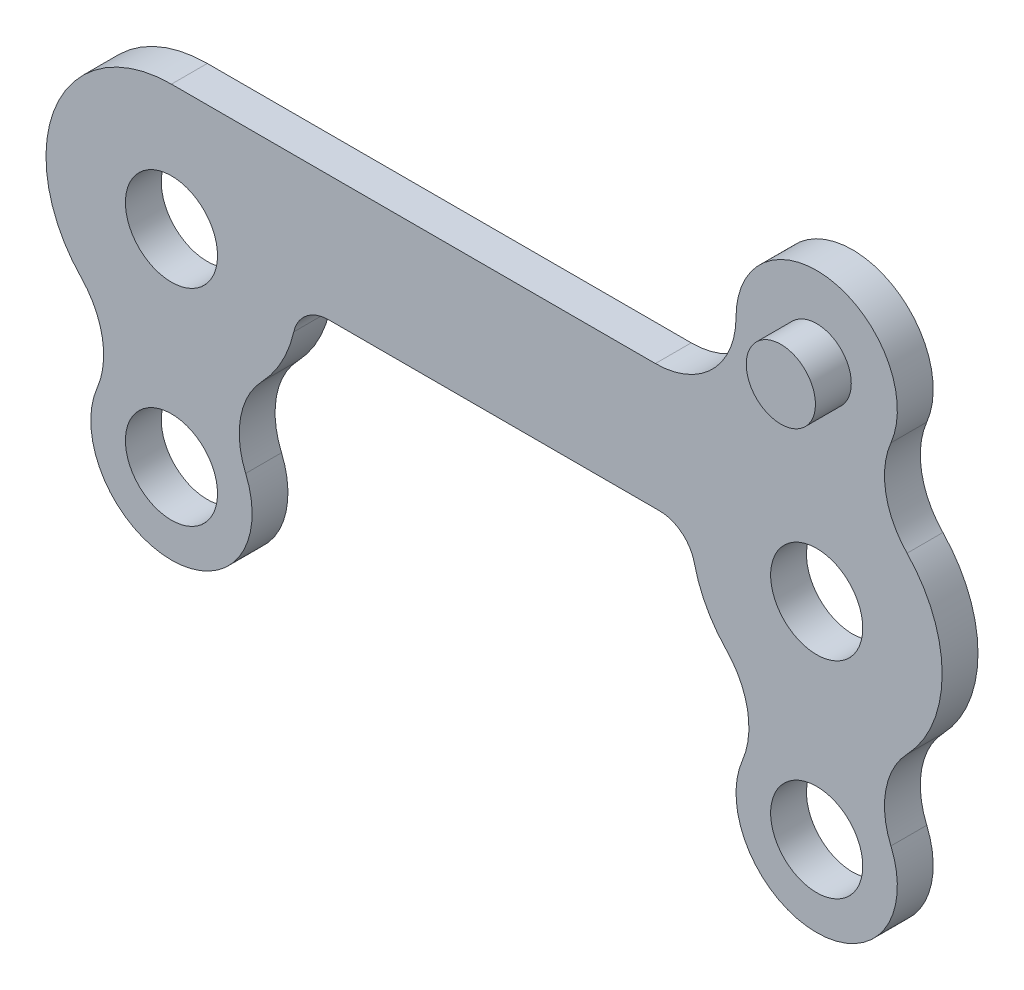
ISO-10303-21;
HEADER;
FILE_DESCRIPTION(('STEP AP214'),'2;1');
FILE_NAME('part.step','',(''),(''),'','','');
FILE_SCHEMA(('AUTOMOTIVE_DESIGN { 1 0 10303 214 1 1 1 1 }'));
ENDSEC;
DATA;
#1=APPLICATION_CONTEXT('core data for automotive mechanical design processes');
#2=APPLICATION_PROTOCOL_DEFINITION('international standard','automotive_design',2000,#1);
#3=PRODUCT_CONTEXT('',#1,'mechanical');
#4=PRODUCT('Part','Part','',(#3));
#5=PRODUCT_RELATED_PRODUCT_CATEGORY('part','',(#4));
#6=PRODUCT_DEFINITION_FORMATION('','',#4);
#7=PRODUCT_DEFINITION_CONTEXT('part definition',#1,'design');
#8=PRODUCT_DEFINITION('design','',#6,#7);
#9=PRODUCT_DEFINITION_SHAPE('','',#8);
#10=(LENGTH_UNIT() NAMED_UNIT(*) SI_UNIT(.MILLI.,.METRE.));
#11=(NAMED_UNIT(*) PLANE_ANGLE_UNIT() SI_UNIT($,.RADIAN.));
#12=(NAMED_UNIT(*) SI_UNIT($,.STERADIAN.) SOLID_ANGLE_UNIT());
#13=UNCERTAINTY_MEASURE_WITH_UNIT(LENGTH_MEASURE(1.E-05),#10,'distance_accuracy_value','');
#14=(GEOMETRIC_REPRESENTATION_CONTEXT(3) GLOBAL_UNCERTAINTY_ASSIGNED_CONTEXT((#13)) GLOBAL_UNIT_ASSIGNED_CONTEXT((#10,
#11,#12)) REPRESENTATION_CONTEXT('',''));
#15=CARTESIAN_POINT('',(0.,0.,0.));
#16=DIRECTION('',(0.,0.,1.));
#17=DIRECTION('',(1.,0.,0.));
#18=AXIS2_PLACEMENT_3D('',#15,#16,#17);
#19=CARTESIAN_POINT('',(35.149116844667,6.33274456521739,1.5875));
#20=DIRECTION('',(0.,0.,-1.));
#21=DIRECTION('',(-1.,0.,0.));
#22=AXIS2_PLACEMENT_3D('',#19,#20,#21);
#23=CYLINDRICAL_SURFACE('',#22,3.571875);
#24=CARTESIAN_POINT('',(35.149116844667,6.33274456521739,0.));
#25=DIRECTION('',(0.,0.,1.));
#26=DIRECTION('',(1.,0.,0.));
#27=AXIS2_PLACEMENT_3D('',#24,#25,#26);
#28=CIRCLE('',#27,3.571875);
#29=CARTESIAN_POINT('',(31.8620584223335,7.73043478260869,0.));
#30=VERTEX_POINT('',#29);
#31=CARTESIAN_POINT('',(32.5766363402321,3.8547140831758,0.));
#32=VERTEX_POINT('',#31);
#33=EDGE_CURVE('E165',#30,#32,#28,.T.);
#34=ORIENTED_EDGE('',*,*,#33,.F.);
#35=DIRECTION('',(0.,0.,-1.));
#36=VECTOR('',#35,1.);
#37=CARTESIAN_POINT('',(31.8620584223335,7.73043478260869,1.5875));
#38=LINE('',#37,#36);
#39=CARTESIAN_POINT('',(31.8620584223335,7.73043478260869,1.5875));
#40=VERTEX_POINT('',#39);
#41=EDGE_CURVE('E160',#40,#30,#38,.T.);
#42=ORIENTED_EDGE('',*,*,#41,.F.);
#43=CARTESIAN_POINT('',(35.149116844667,6.33274456521739,1.5875));
#44=DIRECTION('',(0.,0.,1.));
#45=DIRECTION('',(1.,0.,0.));
#46=AXIS2_PLACEMENT_3D('',#43,#44,#45);
#47=CIRCLE('',#46,3.571875);
#48=CARTESIAN_POINT('',(32.5766363402321,3.8547140831758,1.5875));
#49=VERTEX_POINT('',#48);
#50=EDGE_CURVE('E163',#40,#49,#47,.T.);
#51=ORIENTED_EDGE('',*,*,#50,.T.);
#52=DIRECTION('',(0.,0.,-1.));
#53=VECTOR('',#52,1.);
#54=CARTESIAN_POINT('',(32.5766363402321,3.8547140831758,1.5875));
#55=LINE('',#54,#53);
#56=EDGE_CURVE('E257',#49,#32,#55,.T.);
#57=ORIENTED_EDGE('',*,*,#56,.T.);
#58=EDGE_LOOP('',(#34,#42,#51,#57));
#59=FACE_BOUND('',#58,.T.);
#60=ADVANCED_FACE('F40',(#59),#23,.F.);
#61=CARTESIAN_POINT('',(28.575,9.128125,1.5875));
#62=DIRECTION('',(0.,0.,-1.));
#63=DIRECTION('',(-1.,0.,0.));
#64=AXIS2_PLACEMENT_3D('',#61,#62,#63);
#65=CYLINDRICAL_SURFACE('',#64,3.571875);
#66=CARTESIAN_POINT('',(28.575,9.128125,0.));
#67=DIRECTION('',(0.,0.,1.));
#68=DIRECTION('',(1.,0.,0.));
#69=AXIS2_PLACEMENT_3D('',#66,#67,#68);
#70=CIRCLE('',#69,3.571875);
#71=CARTESIAN_POINT('',(25.003125,9.128125,0.));
#72=VERTEX_POINT('',#71);
#73=EDGE_CURVE('E260',#30,#72,#70,.T.);
#74=ORIENTED_EDGE('',*,*,#73,.T.);
#75=DIRECTION('',(0.,0.,-1.));
#76=VECTOR('',#75,1.);
#77=CARTESIAN_POINT('',(25.003125,9.128125,1.5875));
#78=LINE('',#77,#76);
#79=CARTESIAN_POINT('',(25.003125,9.128125,1.5875));
#80=VERTEX_POINT('',#79);
#81=EDGE_CURVE('E171',#80,#72,#78,.T.);
#82=ORIENTED_EDGE('',*,*,#81,.F.);
#83=CARTESIAN_POINT('',(28.575,9.128125,1.5875));
#84=DIRECTION('',(0.,0.,1.));
#85=DIRECTION('',(1.,0.,0.));
#86=AXIS2_PLACEMENT_3D('',#83,#84,#85);
#87=CIRCLE('',#86,3.571875);
#88=EDGE_CURVE('E174',#40,#80,#87,.T.);
#89=ORIENTED_EDGE('',*,*,#88,.F.);
#90=ORIENTED_EDGE('',*,*,#41,.T.);
#91=EDGE_LOOP('',(#74,#82,#89,#90));
#92=FACE_BOUND('',#91,.T.);
#93=ADVANCED_FACE('F175',(#92),#65,.T.);
#94=CARTESIAN_POINT('',(21.43125,9.128125,1.5875));
#95=DIRECTION('',(0.,0.,-1.));
#96=DIRECTION('',(-1.,0.,0.));
#97=AXIS2_PLACEMENT_3D('',#94,#95,#96);
#98=CYLINDRICAL_SURFACE('',#97,3.571875);
#99=CARTESIAN_POINT('',(21.43125,9.128125,0.));
#100=DIRECTION('',(0.,0.,1.));
#101=DIRECTION('',(1.,0.,0.));
#102=AXIS2_PLACEMENT_3D('',#99,#100,#101);
#103=CIRCLE('',#102,3.571875);
#104=CARTESIAN_POINT('',(21.43125,5.55625,0.));
#105=VERTEX_POINT('',#104);
#106=EDGE_CURVE('E263',#105,#72,#103,.T.);
#107=ORIENTED_EDGE('',*,*,#106,.F.);
#108=DIRECTION('',(0.,0.,-1.));
#109=VECTOR('',#108,1.);
#110=CARTESIAN_POINT('',(21.43125,5.55625,1.5875));
#111=LINE('',#110,#109);
#112=CARTESIAN_POINT('',(21.43125,5.55625,1.5875));
#113=VERTEX_POINT('',#112);
#114=EDGE_CURVE('E349',#113,#105,#111,.T.);
#115=ORIENTED_EDGE('',*,*,#114,.F.);
#116=CARTESIAN_POINT('',(21.43125,9.128125,1.5875));
#117=DIRECTION('',(0.,0.,1.));
#118=DIRECTION('',(1.,0.,0.));
#119=AXIS2_PLACEMENT_3D('',#116,#117,#118);
#120=CIRCLE('',#119,3.571875);
#121=EDGE_CURVE('E180',#113,#80,#120,.T.);
#122=ORIENTED_EDGE('',*,*,#121,.T.);
#123=ORIENTED_EDGE('',*,*,#81,.T.);
#124=EDGE_LOOP('',(#107,#115,#122,#123));
#125=FACE_BOUND('',#124,.T.);
#126=ADVANCED_FACE('F414',(#125),#98,.F.);
#127=CARTESIAN_POINT('',(0.,5.55625,1.5875));
#128=DIRECTION('',(0.,1.,0.));
#129=DIRECTION('',(0.,0.,1.));
#130=AXIS2_PLACEMENT_3D('',#127,#128,#129);
#131=PLANE('',#130);
#132=DIRECTION('',(1.,0.,0.));
#133=VECTOR('',#132,1.);
#134=CARTESIAN_POINT('',(0.,5.55625,0.));
#135=LINE('',#134,#133);
#136=CARTESIAN_POINT('',(0.,5.55625,0.));
#137=VERTEX_POINT('',#136);
#138=EDGE_CURVE('E267',#137,#105,#135,.T.);
#139=ORIENTED_EDGE('',*,*,#138,.F.);
#140=DIRECTION('',(0.,0.,-1.));
#141=VECTOR('',#140,1.);
#142=CARTESIAN_POINT('',(0.,5.55625,1.5875));
#143=LINE('',#142,#141);
#144=CARTESIAN_POINT('',(0.,5.55625,1.5875));
#145=VERTEX_POINT('',#144);
#146=EDGE_CURVE('E346',#145,#137,#143,.T.);
#147=ORIENTED_EDGE('',*,*,#146,.F.);
#148=DIRECTION('',(1.,0.,0.));
#149=VECTOR('',#148,1.);
#150=CARTESIAN_POINT('',(0.,5.55625,1.5875));
#151=LINE('',#150,#149);
#152=EDGE_CURVE('E200',#145,#113,#151,.T.);
#153=ORIENTED_EDGE('',*,*,#152,.T.);
#154=ORIENTED_EDGE('',*,*,#114,.T.);
#155=EDGE_LOOP('',(#139,#147,#153,#154));
#156=FACE_BOUND('',#155,.T.);
#157=ADVANCED_FACE('F417',(#156),#131,.T.);
#158=CARTESIAN_POINT('',(0.,0.,1.5875));
#159=DIRECTION('',(0.,0.,-1.));
#160=DIRECTION('',(-1.,0.,0.));
#161=AXIS2_PLACEMENT_3D('',#158,#159,#160);
#162=CYLINDRICAL_SURFACE('',#161,5.55625);
#163=CARTESIAN_POINT('',(0.,0.,0.));
#164=DIRECTION('',(0.,0.,1.));
#165=DIRECTION('',(1.,0.,0.));
#166=AXIS2_PLACEMENT_3D('',#163,#164,#165);
#167=CIRCLE('',#166,5.55625);
#168=CARTESIAN_POINT('',(-4.0016363402321,-3.8547140831758,0.));
#169=VERTEX_POINT('',#168);
#170=EDGE_CURVE('E271',#137,#169,#167,.T.);
#171=ORIENTED_EDGE('',*,*,#170,.T.);
#172=DIRECTION('',(0.,0.,-1.));
#173=VECTOR('',#172,1.);
#174=CARTESIAN_POINT('',(-4.0016363402321,-3.8547140831758,1.5875));
#175=LINE('',#174,#173);
#176=CARTESIAN_POINT('',(-4.0016363402321,-3.8547140831758,1.5875));
#177=VERTEX_POINT('',#176);
#178=EDGE_CURVE('E343',#177,#169,#175,.T.);
#179=ORIENTED_EDGE('',*,*,#178,.F.);
#180=CARTESIAN_POINT('',(0.,0.,1.5875));
#181=DIRECTION('',(0.,0.,1.));
#182=DIRECTION('',(1.,0.,0.));
#183=AXIS2_PLACEMENT_3D('',#180,#181,#182);
#184=CIRCLE('',#183,5.55625);
#185=EDGE_CURVE('E204',#145,#177,#184,.T.);
#186=ORIENTED_EDGE('',*,*,#185,.F.);
#187=ORIENTED_EDGE('',*,*,#146,.T.);
#188=EDGE_LOOP('',(#171,#179,#186,#187));
#189=FACE_BOUND('',#188,.T.);
#190=ADVANCED_FACE('F421',(#189),#162,.T.);
#191=CARTESIAN_POINT('',(-6.57411684466701,-6.33274456521738,1.5875));
#192=DIRECTION('',(0.,0.,-1.));
#193=DIRECTION('',(-1.,0.,0.));
#194=AXIS2_PLACEMENT_3D('',#191,#192,#193);
#195=CYLINDRICAL_SURFACE('',#194,3.571875);
#196=CARTESIAN_POINT('',(-6.57411684466701,-6.33274456521738,0.));
#197=DIRECTION('',(0.,0.,1.));
#198=DIRECTION('',(1.,0.,0.));
#199=AXIS2_PLACEMENT_3D('',#196,#197,#198);
#200=CIRCLE('',#199,3.571875);
#201=CARTESIAN_POINT('',(-3.28705842233351,-7.73043478260869,0.));
#202=VERTEX_POINT('',#201);
#203=EDGE_CURVE('E275',#202,#169,#200,.T.);
#204=ORIENTED_EDGE('',*,*,#203,.F.);
#205=DIRECTION('',(0.,0.,-1.));
#206=VECTOR('',#205,1.);
#207=CARTESIAN_POINT('',(-3.28705842233351,-7.73043478260869,1.5875));
#208=LINE('',#207,#206);
#209=CARTESIAN_POINT('',(-3.28705842233351,-7.73043478260869,1.5875));
#210=VERTEX_POINT('',#209);
#211=EDGE_CURVE('E340',#210,#202,#208,.T.);
#212=ORIENTED_EDGE('',*,*,#211,.F.);
#213=CARTESIAN_POINT('',(-6.57411684466701,-6.33274456521738,1.5875));
#214=DIRECTION('',(0.,0.,1.));
#215=DIRECTION('',(1.,0.,0.));
#216=AXIS2_PLACEMENT_3D('',#213,#214,#215);
#217=CIRCLE('',#216,3.571875);
#218=EDGE_CURVE('E207',#210,#177,#217,.T.);
#219=ORIENTED_EDGE('',*,*,#218,.T.);
#220=ORIENTED_EDGE('',*,*,#178,.T.);
#221=EDGE_LOOP('',(#204,#212,#219,#220));
#222=FACE_BOUND('',#221,.T.);
#223=ADVANCED_FACE('F427',(#222),#195,.F.);
#224=CARTESIAN_POINT('',(0.,-9.128125,1.5875));
#225=DIRECTION('',(0.,0.,-1.));
#226=DIRECTION('',(-1.,0.,0.));
#227=AXIS2_PLACEMENT_3D('',#224,#225,#226);
#228=CYLINDRICAL_SURFACE('',#227,3.571875);
#229=CARTESIAN_POINT('',(0.,-9.128125,0.));
#230=DIRECTION('',(0.,0.,1.));
#231=DIRECTION('',(1.,0.,0.));
#232=AXIS2_PLACEMENT_3D('',#229,#230,#231);
#233=CIRCLE('',#232,3.571875);
#234=CARTESIAN_POINT('',(3.28705842233351,-7.73043478260869,0.));
#235=VERTEX_POINT('',#234);
#236=EDGE_CURVE('E280',#202,#235,#233,.T.);
#237=ORIENTED_EDGE('',*,*,#236,.T.);
#238=DIRECTION('',(0.,0.,-1.));
#239=VECTOR('',#238,1.);
#240=CARTESIAN_POINT('',(3.28705842233351,-7.73043478260869,1.5875));
#241=LINE('',#240,#239);
#242=CARTESIAN_POINT('',(3.28705842233351,-7.73043478260869,1.5875));
#243=VERTEX_POINT('',#242);
#244=EDGE_CURVE('E337',#243,#235,#241,.T.);
#245=ORIENTED_EDGE('',*,*,#244,.F.);
#246=CARTESIAN_POINT('',(0.,-9.128125,1.5875));
#247=DIRECTION('',(0.,0.,1.));
#248=DIRECTION('',(1.,0.,0.));
#249=AXIS2_PLACEMENT_3D('',#246,#247,#248);
#250=CIRCLE('',#249,3.571875);
#251=EDGE_CURVE('E212',#210,#243,#250,.T.);
#252=ORIENTED_EDGE('',*,*,#251,.F.);
#253=ORIENTED_EDGE('',*,*,#211,.T.);
#254=EDGE_LOOP('',(#237,#245,#252,#253));
#255=FACE_BOUND('',#254,.T.);
#256=ADVANCED_FACE('F430',(#255),#228,.T.);
#257=CARTESIAN_POINT('',(6.57411684466701,-6.33274456521738,1.5875));
#258=DIRECTION('',(0.,0.,-1.));
#259=DIRECTION('',(-1.,0.,0.));
#260=AXIS2_PLACEMENT_3D('',#257,#258,#259);
#261=CYLINDRICAL_SURFACE('',#260,3.571875);
#262=CARTESIAN_POINT('',(6.57411684466701,-6.33274456521738,0.));
#263=DIRECTION('',(0.,0.,1.));
#264=DIRECTION('',(1.,0.,0.));
#265=AXIS2_PLACEMENT_3D('',#262,#263,#264);
#266=CIRCLE('',#265,3.571875);
#267=CARTESIAN_POINT('',(4.0016363402321,-3.8547140831758,0.));
#268=VERTEX_POINT('',#267);
#269=EDGE_CURVE('E284',#268,#235,#266,.T.);
#270=ORIENTED_EDGE('',*,*,#269,.F.);
#271=DIRECTION('',(0.,0.,-1.));
#272=VECTOR('',#271,1.);
#273=CARTESIAN_POINT('',(4.0016363402321,-3.8547140831758,1.5875));
#274=LINE('',#273,#272);
#275=CARTESIAN_POINT('',(4.0016363402321,-3.8547140831758,1.5875));
#276=VERTEX_POINT('',#275);
#277=EDGE_CURVE('E334',#276,#268,#274,.T.);
#278=ORIENTED_EDGE('',*,*,#277,.F.);
#279=CARTESIAN_POINT('',(6.57411684466701,-6.33274456521738,1.5875));
#280=DIRECTION('',(0.,0.,1.));
#281=DIRECTION('',(1.,0.,0.));
#282=AXIS2_PLACEMENT_3D('',#279,#280,#281);
#283=CIRCLE('',#282,3.571875);
#284=EDGE_CURVE('E215',#276,#243,#283,.T.);
#285=ORIENTED_EDGE('',*,*,#284,.T.);
#286=ORIENTED_EDGE('',*,*,#244,.T.);
#287=EDGE_LOOP('',(#270,#278,#285,#286));
#288=FACE_BOUND('',#287,.T.);
#289=ADVANCED_FACE('F433',(#288),#261,.F.);
#290=CARTESIAN_POINT('',(5.41732176416083,-1.23472222222222,0.));
#291=VERTEX_POINT('',#290);
#292=EDGE_CURVE('E276',#268,#291,#167,.T.);
#293=ORIENTED_EDGE('',*,*,#292,.T.);
#294=DIRECTION('',(0.,0.,-1.));
#295=VECTOR('',#294,1.);
#296=CARTESIAN_POINT('',(5.41732176416083,-1.23472222222222,1.5875));
#297=LINE('',#296,#295);
#298=CARTESIAN_POINT('',(5.41732176416083,-1.23472222222222,1.5875));
#299=VERTEX_POINT('',#298);
#300=EDGE_CURVE('E56',#291,#299,#297,.F.);
#301=ORIENTED_EDGE('',*,*,#300,.T.);
#302=EDGE_CURVE('E208',#276,#299,#184,.T.);
#303=ORIENTED_EDGE('',*,*,#302,.F.);
#304=ORIENTED_EDGE('',*,*,#277,.T.);
#305=EDGE_LOOP('',(#293,#301,#303,#304));
#306=FACE_BOUND('',#305,.T.);
#307=ADVANCED_FACE('F434',(#306),#162,.T.);
#308=CARTESIAN_POINT('',(0.,0.,1.5875));
#309=DIRECTION('',(0.,1.,0.));
#310=DIRECTION('',(0.,0.,1.));
#311=AXIS2_PLACEMENT_3D('',#308,#309,#310);
#312=PLANE('',#311);
#313=DIRECTION('',(1.,0.,0.));
#314=VECTOR('',#313,1.);
#315=CARTESIAN_POINT('',(0.,0.,0.));
#316=LINE('',#315,#314);
#317=CARTESIAN_POINT('',(6.9651279824925,0.,0.));
#318=VERTEX_POINT('',#317);
#319=CARTESIAN_POINT('',(21.6098720175075,0.,0.));
#320=VERTEX_POINT('',#319);
#321=EDGE_CURVE('E288',#318,#320,#316,.T.);
#322=ORIENTED_EDGE('',*,*,#321,.T.);
#323=DIRECTION('',(0.,0.,1.));
#324=VECTOR('',#323,1.);
#325=CARTESIAN_POINT('',(21.6098720175075,0.,1.5875));
#326=LINE('',#325,#324);
#327=CARTESIAN_POINT('',(21.6098720175075,0.,1.5875));
#328=VERTEX_POINT('',#327);
#329=EDGE_CURVE('E361',#320,#328,#326,.T.);
#330=ORIENTED_EDGE('',*,*,#329,.T.);
#331=DIRECTION('',(1.,0.,0.));
#332=VECTOR('',#331,1.);
#333=CARTESIAN_POINT('',(0.,0.,1.5875));
#334=LINE('',#333,#332);
#335=CARTESIAN_POINT('',(6.9651279824925,0.,1.5875));
#336=VERTEX_POINT('',#335);
#337=EDGE_CURVE('E219',#336,#328,#334,.T.);
#338=ORIENTED_EDGE('',*,*,#337,.F.);
#339=DIRECTION('',(0.,0.,1.));
#340=VECTOR('',#339,1.);
#341=CARTESIAN_POINT('',(6.9651279824925,0.,0.));
#342=LINE('',#341,#340);
#343=EDGE_CURVE('E357',#336,#318,#342,.F.);
#344=ORIENTED_EDGE('',*,*,#343,.T.);
#345=EDGE_LOOP('',(#322,#330,#338,#344));
#346=FACE_BOUND('',#345,.T.);
#347=ADVANCED_FACE('F380',(#346),#312,.F.);
#348=CARTESIAN_POINT('',(28.575,0.,1.5875));
#349=DIRECTION('',(0.,0.,-1.));
#350=DIRECTION('',(-1.,0.,0.));
#351=AXIS2_PLACEMENT_3D('',#348,#349,#350);
#352=CYLINDRICAL_SURFACE('',#351,5.55625);
#353=CARTESIAN_POINT('',(28.575,0.,1.5875));
#354=DIRECTION('',(0.,0.,1.));
#355=DIRECTION('',(1.,0.,0.));
#356=AXIS2_PLACEMENT_3D('',#353,#354,#355);
#357=CIRCLE('',#356,5.55625);
#358=CARTESIAN_POINT('',(23.1576782358392,-1.23472222222222,1.5875));
#359=VERTEX_POINT('',#358);
#360=CARTESIAN_POINT('',(24.5733636597679,-3.8547140831758,1.5875));
#361=VERTEX_POINT('',#360);
#362=EDGE_CURVE('E223',#359,#361,#357,.T.);
#363=ORIENTED_EDGE('',*,*,#362,.F.);
#364=DIRECTION('',(0.,0.,-1.));
#365=VECTOR('',#364,1.);
#366=CARTESIAN_POINT('',(23.1576782358392,-1.23472222222222,1.5875));
#367=LINE('',#366,#365);
#368=CARTESIAN_POINT('',(23.1576782358392,-1.23472222222222,0.));
#369=VERTEX_POINT('',#368);
#370=EDGE_CURVE('E170',#359,#369,#367,.T.);
#371=ORIENTED_EDGE('',*,*,#370,.T.);
#372=CARTESIAN_POINT('',(28.575,0.,0.));
#373=DIRECTION('',(0.,0.,1.));
#374=DIRECTION('',(1.,0.,0.));
#375=AXIS2_PLACEMENT_3D('',#372,#373,#374);
#376=CIRCLE('',#375,5.55625);
#377=CARTESIAN_POINT('',(24.5733636597679,-3.8547140831758,0.));
#378=VERTEX_POINT('',#377);
#379=EDGE_CURVE('E292',#369,#378,#376,.T.);
#380=ORIENTED_EDGE('',*,*,#379,.T.);
#381=DIRECTION('',(0.,0.,-1.));
#382=VECTOR('',#381,1.);
#383=CARTESIAN_POINT('',(24.5733636597679,-3.8547140831758,1.5875));
#384=LINE('',#383,#382);
#385=EDGE_CURVE('E330',#361,#378,#384,.T.);
#386=ORIENTED_EDGE('',*,*,#385,.F.);
#387=EDGE_LOOP('',(#363,#371,#380,#386));
#388=FACE_BOUND('',#387,.T.);
#389=ADVANCED_FACE('F391',(#388),#352,.T.);
#390=CARTESIAN_POINT('',(22.000883155333,-6.33274456521739,1.5875));
#391=DIRECTION('',(0.,0.,-1.));
#392=DIRECTION('',(-1.,0.,0.));
#393=AXIS2_PLACEMENT_3D('',#390,#391,#392);
#394=CYLINDRICAL_SURFACE('',#393,3.571875);
#395=CARTESIAN_POINT('',(22.000883155333,-6.33274456521739,0.));
#396=DIRECTION('',(0.,0.,1.));
#397=DIRECTION('',(1.,0.,0.));
#398=AXIS2_PLACEMENT_3D('',#395,#396,#397);
#399=CIRCLE('',#398,3.571875);
#400=CARTESIAN_POINT('',(25.2879415776665,-7.7304347826087,0.));
#401=VERTEX_POINT('',#400);
#402=EDGE_CURVE('E295',#401,#378,#399,.T.);
#403=ORIENTED_EDGE('',*,*,#402,.F.);
#404=DIRECTION('',(0.,0.,-1.));
#405=VECTOR('',#404,1.);
#406=CARTESIAN_POINT('',(25.2879415776665,-7.7304347826087,1.5875));
#407=LINE('',#406,#405);
#408=CARTESIAN_POINT('',(25.2879415776665,-7.7304347826087,1.5875));
#409=VERTEX_POINT('',#408);
#410=EDGE_CURVE('E327',#409,#401,#407,.T.);
#411=ORIENTED_EDGE('',*,*,#410,.F.);
#412=CARTESIAN_POINT('',(22.000883155333,-6.33274456521739,1.5875));
#413=DIRECTION('',(0.,0.,1.));
#414=DIRECTION('',(1.,0.,0.));
#415=AXIS2_PLACEMENT_3D('',#412,#413,#414);
#416=CIRCLE('',#415,3.571875);
#417=EDGE_CURVE('E226',#409,#361,#416,.T.);
#418=ORIENTED_EDGE('',*,*,#417,.T.);
#419=ORIENTED_EDGE('',*,*,#385,.T.);
#420=EDGE_LOOP('',(#403,#411,#418,#419));
#421=FACE_BOUND('',#420,.T.);
#422=ADVANCED_FACE('F398',(#421),#394,.F.);
#423=CARTESIAN_POINT('',(28.575,-9.128125,1.5875));
#424=DIRECTION('',(0.,0.,-1.));
#425=DIRECTION('',(-1.,0.,0.));
#426=AXIS2_PLACEMENT_3D('',#423,#424,#425);
#427=CYLINDRICAL_SURFACE('',#426,3.57187499999999);
#428=CARTESIAN_POINT('',(28.575,-9.128125,0.));
#429=DIRECTION('',(0.,0.,1.));
#430=DIRECTION('',(1.,0.,0.));
#431=AXIS2_PLACEMENT_3D('',#428,#429,#430);
#432=CIRCLE('',#431,3.57187499999999);
#433=CARTESIAN_POINT('',(31.8620584223335,-7.73043478260869,0.));
#434=VERTEX_POINT('',#433);
#435=EDGE_CURVE('E300',#401,#434,#432,.T.);
#436=ORIENTED_EDGE('',*,*,#435,.T.);
#437=DIRECTION('',(0.,0.,-1.));
#438=VECTOR('',#437,1.);
#439=CARTESIAN_POINT('',(31.8620584223335,-7.73043478260869,1.5875));
#440=LINE('',#439,#438);
#441=CARTESIAN_POINT('',(31.8620584223335,-7.73043478260869,1.5875));
#442=VERTEX_POINT('',#441);
#443=EDGE_CURVE('E324',#442,#434,#440,.T.);
#444=ORIENTED_EDGE('',*,*,#443,.F.);
#445=CARTESIAN_POINT('',(28.575,-9.128125,1.5875));
#446=DIRECTION('',(0.,0.,1.));
#447=DIRECTION('',(1.,0.,0.));
#448=AXIS2_PLACEMENT_3D('',#445,#446,#447);
#449=CIRCLE('',#448,3.57187499999999);
#450=EDGE_CURVE('E230',#409,#442,#449,.T.);
#451=ORIENTED_EDGE('',*,*,#450,.F.);
#452=ORIENTED_EDGE('',*,*,#410,.T.);
#453=EDGE_LOOP('',(#436,#444,#451,#452));
#454=FACE_BOUND('',#453,.T.);
#455=ADVANCED_FACE('F401',(#454),#427,.T.);
#456=CARTESIAN_POINT('',(35.149116844667,-6.33274456521738,1.5875));
#457=DIRECTION('',(0.,0.,-1.));
#458=DIRECTION('',(-1.,0.,0.));
#459=AXIS2_PLACEMENT_3D('',#456,#457,#458);
#460=CYLINDRICAL_SURFACE('',#459,3.57187499999999);
#461=CARTESIAN_POINT('',(35.149116844667,-6.33274456521738,0.));
#462=DIRECTION('',(0.,0.,1.));
#463=DIRECTION('',(1.,0.,0.));
#464=AXIS2_PLACEMENT_3D('',#461,#462,#463);
#465=CIRCLE('',#464,3.57187499999999);
#466=CARTESIAN_POINT('',(32.5766363402321,-3.8547140831758,0.));
#467=VERTEX_POINT('',#466);
#468=EDGE_CURVE('E304',#467,#434,#465,.T.);
#469=ORIENTED_EDGE('',*,*,#468,.F.);
#470=DIRECTION('',(0.,0.,-1.));
#471=VECTOR('',#470,1.);
#472=CARTESIAN_POINT('',(32.5766363402321,-3.8547140831758,1.5875));
#473=LINE('',#472,#471);
#474=CARTESIAN_POINT('',(32.5766363402321,-3.8547140831758,1.5875));
#475=VERTEX_POINT('',#474);
#476=EDGE_CURVE('E321',#475,#467,#473,.T.);
#477=ORIENTED_EDGE('',*,*,#476,.F.);
#478=CARTESIAN_POINT('',(35.149116844667,-6.33274456521738,1.5875));
#479=DIRECTION('',(0.,0.,1.));
#480=DIRECTION('',(1.,0.,0.));
#481=AXIS2_PLACEMENT_3D('',#478,#479,#480);
#482=CIRCLE('',#481,3.57187499999999);
#483=EDGE_CURVE('E233',#475,#442,#482,.T.);
#484=ORIENTED_EDGE('',*,*,#483,.T.);
#485=ORIENTED_EDGE('',*,*,#443,.T.);
#486=EDGE_LOOP('',(#469,#477,#484,#485));
#487=FACE_BOUND('',#486,.T.);
#488=ADVANCED_FACE('F404',(#487),#460,.F.);
#489=CARTESIAN_POINT('',(0.,-9.128125,1.5875));
#490=DIRECTION('',(0.,0.,-1.));
#491=DIRECTION('',(-1.,0.,0.));
#492=AXIS2_PLACEMENT_3D('',#489,#490,#491);
#493=CYLINDRICAL_SURFACE('',#492,2.0399375);
#494=CARTESIAN_POINT('',(0.,-9.128125,1.5875));
#495=DIRECTION('',(0.,0.,1.));
#496=DIRECTION('',(1.,0.,0.));
#497=AXIS2_PLACEMENT_3D('',#494,#495,#496);
#498=CIRCLE('',#497,2.0399375);
#499=CARTESIAN_POINT('',(2.0399375,-9.128125,1.5875));
#500=VERTEX_POINT('',#499);
#501=EDGE_CURVE('E245',#500,#500,#498,.T.);
#502=ORIENTED_EDGE('',*,*,#501,.T.);
#503=EDGE_LOOP('',(#502));
#504=FACE_BOUND('',#503,.T.);
#505=CARTESIAN_POINT('',(0.,-9.128125,0.));
#506=DIRECTION('',(0.,0.,1.));
#507=DIRECTION('',(1.,0.,0.));
#508=AXIS2_PLACEMENT_3D('',#505,#506,#507);
#509=CIRCLE('',#508,2.0399375);
#510=CARTESIAN_POINT('',(2.0399375,-9.128125,0.));
#511=VERTEX_POINT('',#510);
#512=EDGE_CURVE('E193',#511,#511,#509,.T.);
#513=ORIENTED_EDGE('',*,*,#512,.F.);
#514=EDGE_LOOP('',(#513));
#515=FACE_BOUND('',#514,.T.);
#516=ADVANCED_FACE('F547',(#504,#515),#493,.F.);
#517=CARTESIAN_POINT('',(28.575,0.,1.5875));
#518=DIRECTION('',(0.,0.,-1.));
#519=DIRECTION('',(-1.,0.,0.));
#520=AXIS2_PLACEMENT_3D('',#517,#518,#519);
#521=CYLINDRICAL_SURFACE('',#520,2.0399375);
#522=CARTESIAN_POINT('',(28.575,0.,1.5875));
#523=DIRECTION('',(0.,0.,1.));
#524=DIRECTION('',(1.,0.,0.));
#525=AXIS2_PLACEMENT_3D('',#522,#523,#524);
#526=CIRCLE('',#525,2.0399375);
#527=CARTESIAN_POINT('',(30.6149375,0.,1.5875));
#528=VERTEX_POINT('',#527);
#529=EDGE_CURVE('E241',#528,#528,#526,.T.);
#530=ORIENTED_EDGE('',*,*,#529,.T.);
#531=EDGE_LOOP('',(#530));
#532=FACE_BOUND('',#531,.T.);
#533=CARTESIAN_POINT('',(28.575,0.,0.));
#534=DIRECTION('',(0.,0.,1.));
#535=DIRECTION('',(1.,0.,0.));
#536=AXIS2_PLACEMENT_3D('',#533,#534,#535);
#537=CIRCLE('',#536,2.0399375);
#538=CARTESIAN_POINT('',(30.6149375,0.,0.));
#539=VERTEX_POINT('',#538);
#540=EDGE_CURVE('E312',#539,#539,#537,.T.);
#541=ORIENTED_EDGE('',*,*,#540,.F.);
#542=EDGE_LOOP('',(#541));
#543=FACE_BOUND('',#542,.T.);
#544=ADVANCED_FACE('F537',(#532,#543),#521,.F.);
#545=CARTESIAN_POINT('',(0.,0.,1.5875));
#546=DIRECTION('',(0.,0.,-1.));
#547=DIRECTION('',(-1.,0.,0.));
#548=AXIS2_PLACEMENT_3D('',#545,#546,#547);
#549=CYLINDRICAL_SURFACE('',#548,2.0399375);
#550=CARTESIAN_POINT('',(0.,0.,1.5875));
#551=DIRECTION('',(0.,0.,1.));
#552=DIRECTION('',(1.,0.,0.));
#553=AXIS2_PLACEMENT_3D('',#550,#551,#552);
#554=CIRCLE('',#553,2.0399375);
#555=CARTESIAN_POINT('',(2.0399375,0.,1.5875));
#556=VERTEX_POINT('',#555);
#557=EDGE_CURVE('E237',#556,#556,#554,.T.);
#558=ORIENTED_EDGE('',*,*,#557,.T.);
#559=EDGE_LOOP('',(#558));
#560=FACE_BOUND('',#559,.T.);
#561=CARTESIAN_POINT('',(0.,0.,0.));
#562=DIRECTION('',(0.,0.,1.));
#563=DIRECTION('',(1.,0.,0.));
#564=AXIS2_PLACEMENT_3D('',#561,#562,#563);
#565=CIRCLE('',#564,2.0399375);
#566=CARTESIAN_POINT('',(2.0399375,0.,0.));
#567=VERTEX_POINT('',#566);
#568=EDGE_CURVE('E308',#567,#567,#565,.T.);
#569=ORIENTED_EDGE('',*,*,#568,.F.);
#570=EDGE_LOOP('',(#569));
#571=FACE_BOUND('',#570,.T.);
#572=ADVANCED_FACE('F529',(#560,#571),#549,.F.);
#573=EDGE_CURVE('E296',#467,#32,#376,.T.);
#574=ORIENTED_EDGE('',*,*,#573,.T.);
#575=ORIENTED_EDGE('',*,*,#56,.F.);
#576=EDGE_CURVE('E186',#475,#49,#357,.T.);
#577=ORIENTED_EDGE('',*,*,#576,.F.);
#578=ORIENTED_EDGE('',*,*,#476,.T.);
#579=EDGE_LOOP('',(#574,#575,#577,#578));
#580=FACE_BOUND('',#579,.T.);
#581=ADVANCED_FACE('F408',(#580),#352,.T.);
#582=CARTESIAN_POINT('',(28.575,-9.128125,1.5875));
#583=DIRECTION('',(0.,0.,-1.));
#584=DIRECTION('',(-1.,0.,0.));
#585=AXIS2_PLACEMENT_3D('',#582,#583,#584);
#586=CYLINDRICAL_SURFACE('',#585,2.0399375);
#587=CARTESIAN_POINT('',(28.575,-9.128125,1.5875));
#588=DIRECTION('',(0.,0.,1.));
#589=DIRECTION('',(1.,0.,0.));
#590=AXIS2_PLACEMENT_3D('',#587,#588,#589);
#591=CIRCLE('',#590,2.0399375);
#592=CARTESIAN_POINT('',(30.6149375,-9.128125,1.5875));
#593=VERTEX_POINT('',#592);
#594=EDGE_CURVE('E253',#593,#593,#591,.T.);
#595=ORIENTED_EDGE('',*,*,#594,.T.);
#596=EDGE_LOOP('',(#595));
#597=FACE_BOUND('',#596,.T.);
#598=CARTESIAN_POINT('',(28.575,-9.128125,0.));
#599=DIRECTION('',(0.,0.,1.));
#600=DIRECTION('',(1.,0.,0.));
#601=AXIS2_PLACEMENT_3D('',#598,#599,#600);
#602=CIRCLE('',#601,2.0399375);
#603=CARTESIAN_POINT('',(30.6149375,-9.128125,0.));
#604=VERTEX_POINT('',#603);
#605=EDGE_CURVE('E189',#604,#604,#602,.T.);
#606=ORIENTED_EDGE('',*,*,#605,.F.);
#607=EDGE_LOOP('',(#606));
#608=FACE_BOUND('',#607,.T.);
#609=ADVANCED_FACE('F483',(#597,#608),#586,.F.);
#610=CARTESIAN_POINT('',(0.,0.,1.5875));
#611=DIRECTION('',(0.,0.,1.));
#612=DIRECTION('',(1.,0.,0.));
#613=AXIS2_PLACEMENT_3D('',#610,#611,#612);
#614=PLANE('',#613);
#615=ORIENTED_EDGE('',*,*,#50,.F.);
#616=ORIENTED_EDGE('',*,*,#88,.T.);
#617=ORIENTED_EDGE('',*,*,#121,.F.);
#618=ORIENTED_EDGE('',*,*,#152,.F.);
#619=ORIENTED_EDGE('',*,*,#185,.T.);
#620=ORIENTED_EDGE('',*,*,#218,.F.);
#621=ORIENTED_EDGE('',*,*,#251,.T.);
#622=ORIENTED_EDGE('',*,*,#284,.F.);
#623=ORIENTED_EDGE('',*,*,#302,.T.);
#624=CARTESIAN_POINT('',(6.9651279824925,-1.5875,1.5875));
#625=DIRECTION('',(0.,0.,1.));
#626=DIRECTION('',(1.,0.,0.));
#627=AXIS2_PLACEMENT_3D('',#624,#625,#626);
#628=CIRCLE('',#627,1.5875);
#629=EDGE_CURVE('E11',#299,#336,#628,.F.);
#630=ORIENTED_EDGE('',*,*,#629,.T.);
#631=ORIENTED_EDGE('',*,*,#337,.T.);
#632=CARTESIAN_POINT('',(21.6098720175075,-1.5875,1.5875));
#633=DIRECTION('',(0.,0.,1.));
#634=DIRECTION('',(1.,0.,0.));
#635=AXIS2_PLACEMENT_3D('',#632,#633,#634);
#636=CIRCLE('',#635,1.5875);
#637=EDGE_CURVE('E369',#328,#359,#636,.F.);
#638=ORIENTED_EDGE('',*,*,#637,.T.);
#639=ORIENTED_EDGE('',*,*,#362,.T.);
#640=ORIENTED_EDGE('',*,*,#417,.F.);
#641=ORIENTED_EDGE('',*,*,#450,.T.);
#642=ORIENTED_EDGE('',*,*,#483,.F.);
#643=ORIENTED_EDGE('',*,*,#576,.T.);
#644=EDGE_LOOP('',(#615,#616,#617,#618,#619,#620,#621,#622,#623,#630,#631,#638,#639,#640,#641,
#642,#643));
#645=FACE_BOUND('',#644,.T.);
#646=ORIENTED_EDGE('',*,*,#557,.F.);
#647=EDGE_LOOP('',(#646));
#648=FACE_BOUND('',#647,.T.);
#649=ORIENTED_EDGE('',*,*,#529,.F.);
#650=EDGE_LOOP('',(#649));
#651=FACE_BOUND('',#650,.T.);
#652=ORIENTED_EDGE('',*,*,#501,.F.);
#653=EDGE_LOOP('',(#652));
#654=FACE_BOUND('',#653,.T.);
#655=CARTESIAN_POINT('',(28.575,9.128125,1.5875));
#656=DIRECTION('',(0.,0.,1.));
#657=DIRECTION('',(1.,0.,0.));
#658=AXIS2_PLACEMENT_3D('',#655,#656,#657);
#659=CIRCLE('',#658,1.5319375);
#660=CARTESIAN_POINT('',(30.1069375,9.128125,1.5875));
#661=VERTEX_POINT('',#660);
#662=EDGE_CURVE('E249',#661,#661,#659,.T.);
#663=ORIENTED_EDGE('',*,*,#662,.F.);
#664=EDGE_LOOP('',(#663));
#665=FACE_BOUND('',#664,.T.);
#666=ORIENTED_EDGE('',*,*,#594,.F.);
#667=EDGE_LOOP('',(#666));
#668=FACE_BOUND('',#667,.T.);
#669=ADVANCED_FACE('F182',(#645,#648,#651,#654,#665,#668),#614,.T.);
#670=CARTESIAN_POINT('',(0.,0.,0.));
#671=DIRECTION('',(0.,0.,1.));
#672=DIRECTION('',(1.,0.,0.));
#673=AXIS2_PLACEMENT_3D('',#670,#671,#672);
#674=PLANE('',#673);
#675=ORIENTED_EDGE('',*,*,#33,.T.);
#676=ORIENTED_EDGE('',*,*,#573,.F.);
#677=ORIENTED_EDGE('',*,*,#468,.T.);
#678=ORIENTED_EDGE('',*,*,#435,.F.);
#679=ORIENTED_EDGE('',*,*,#402,.T.);
#680=ORIENTED_EDGE('',*,*,#379,.F.);
#681=CARTESIAN_POINT('',(21.6098720175075,-1.5875,0.));
#682=DIRECTION('',(0.,0.,1.));
#683=DIRECTION('',(1.,0.,0.));
#684=AXIS2_PLACEMENT_3D('',#681,#682,#683);
#685=CIRCLE('',#684,1.5875);
#686=EDGE_CURVE('E366',#369,#320,#685,.T.);
#687=ORIENTED_EDGE('',*,*,#686,.T.);
#688=ORIENTED_EDGE('',*,*,#321,.F.);
#689=CARTESIAN_POINT('',(6.9651279824925,-1.5875,0.));
#690=DIRECTION('',(0.,0.,1.));
#691=DIRECTION('',(1.,0.,0.));
#692=AXIS2_PLACEMENT_3D('',#689,#690,#691);
#693=CIRCLE('',#692,1.5875);
#694=EDGE_CURVE('E49',#318,#291,#693,.T.);
#695=ORIENTED_EDGE('',*,*,#694,.T.);
#696=ORIENTED_EDGE('',*,*,#292,.F.);
#697=ORIENTED_EDGE('',*,*,#269,.T.);
#698=ORIENTED_EDGE('',*,*,#236,.F.);
#699=ORIENTED_EDGE('',*,*,#203,.T.);
#700=ORIENTED_EDGE('',*,*,#170,.F.);
#701=ORIENTED_EDGE('',*,*,#138,.T.);
#702=ORIENTED_EDGE('',*,*,#106,.T.);
#703=ORIENTED_EDGE('',*,*,#73,.F.);
#704=EDGE_LOOP('',(#675,#676,#677,#678,#679,#680,#687,#688,#695,#696,#697,#698,#699,#700,#701,
#702,#703));
#705=FACE_BOUND('',#704,.T.);
#706=ORIENTED_EDGE('',*,*,#568,.T.);
#707=EDGE_LOOP('',(#706));
#708=FACE_BOUND('',#707,.T.);
#709=ORIENTED_EDGE('',*,*,#540,.T.);
#710=EDGE_LOOP('',(#709));
#711=FACE_BOUND('',#710,.T.);
#712=ORIENTED_EDGE('',*,*,#512,.T.);
#713=EDGE_LOOP('',(#712));
#714=FACE_BOUND('',#713,.T.);
#715=ORIENTED_EDGE('',*,*,#605,.T.);
#716=EDGE_LOOP('',(#715));
#717=FACE_BOUND('',#716,.T.);
#718=ADVANCED_FACE('F382',(#705,#708,#711,#714,#717),#674,.F.);
#719=CARTESIAN_POINT('',(28.575,9.128125,3.175));
#720=DIRECTION('',(0.,0.,-1.));
#721=DIRECTION('',(-1.,0.,0.));
#722=AXIS2_PLACEMENT_3D('',#719,#720,#721);
#723=CYLINDRICAL_SURFACE('',#722,1.5319375);
#724=ORIENTED_EDGE('',*,*,#662,.T.);
#725=EDGE_LOOP('',(#724));
#726=FACE_BOUND('',#725,.T.);
#727=CARTESIAN_POINT('',(28.575,9.128125,3.175));
#728=DIRECTION('',(0.,0.,1.));
#729=DIRECTION('',(1.,0.,0.));
#730=AXIS2_PLACEMENT_3D('',#727,#728,#729);
#731=CIRCLE('',#730,1.5319375);
#732=CARTESIAN_POINT('',(30.1069375,9.128125,3.175));
#733=VERTEX_POINT('',#732);
#734=EDGE_CURVE('E196',#733,#733,#731,.T.);
#735=ORIENTED_EDGE('',*,*,#734,.F.);
#736=EDGE_LOOP('',(#735));
#737=FACE_BOUND('',#736,.T.);
#738=ADVANCED_FACE('F442',(#726,#737),#723,.T.);
#739=CARTESIAN_POINT('',(0.,0.,3.175));
#740=DIRECTION('',(0.,0.,1.));
#741=DIRECTION('',(1.,0.,0.));
#742=AXIS2_PLACEMENT_3D('',#739,#740,#741);
#743=PLANE('',#742);
#744=ORIENTED_EDGE('',*,*,#734,.T.);
#745=EDGE_LOOP('',(#744));
#746=FACE_BOUND('',#745,.T.);
#747=ADVANCED_FACE('F440',(#746),#743,.T.);
#748=CARTESIAN_POINT('',(21.6098720175075,-1.5875,1.5875));
#749=DIRECTION('',(0.,0.,-1.));
#750=DIRECTION('',(-1.,0.,0.));
#751=AXIS2_PLACEMENT_3D('',#748,#749,#750);
#752=CYLINDRICAL_SURFACE('',#751,1.5875);
#753=ORIENTED_EDGE('',*,*,#637,.F.);
#754=ORIENTED_EDGE('',*,*,#329,.F.);
#755=ORIENTED_EDGE('',*,*,#686,.F.);
#756=ORIENTED_EDGE('',*,*,#370,.F.);
#757=EDGE_LOOP('',(#753,#754,#755,#756));
#758=FACE_BOUND('',#757,.T.);
#759=ADVANCED_FACE('F388',(#758),#752,.F.);
#760=CARTESIAN_POINT('',(6.9651279824925,-1.5875,1.5875));
#761=DIRECTION('',(0.,0.,-1.));
#762=DIRECTION('',(-1.,0.,0.));
#763=AXIS2_PLACEMENT_3D('',#760,#761,#762);
#764=CYLINDRICAL_SURFACE('',#763,1.5875);
#765=ORIENTED_EDGE('',*,*,#629,.F.);
#766=ORIENTED_EDGE('',*,*,#300,.F.);
#767=ORIENTED_EDGE('',*,*,#694,.F.);
#768=ORIENTED_EDGE('',*,*,#343,.F.);
#769=EDGE_LOOP('',(#765,#766,#767,#768));
#770=FACE_BOUND('',#769,.T.);
#771=ADVANCED_FACE('F42',(#770),#764,.F.);
#772=CLOSED_SHELL('',(#60,#93,#126,#157,#190,#223,#256,#289,#307,#347,#389,#422,#455,#488,#516,
#544,#572,#581,#609,#669,#718,#738,#747,#759,#771));
#773=MANIFOLD_SOLID_BREP('B2',#772);
#774=ADVANCED_BREP_SHAPE_REPRESENTATION('',(#18,#773),#14);
#775=SHAPE_DEFINITION_REPRESENTATION(#9,#774);
ENDSEC;
END-ISO-10303-21;
